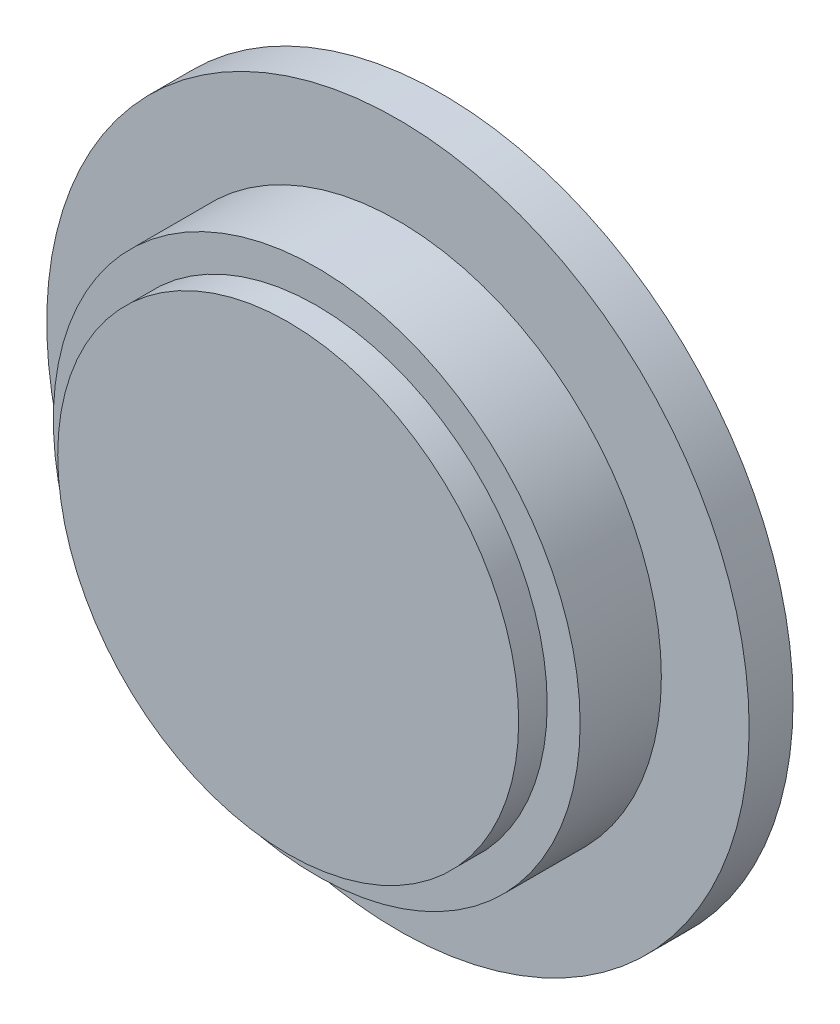
ISO-10303-21;
HEADER;
FILE_DESCRIPTION(('STEP AP214'),'2;1');
FILE_NAME('part.step','',(''),(''),'','','');
FILE_SCHEMA(('AUTOMOTIVE_DESIGN { 1 0 10303 214 1 1 1 1 }'));
ENDSEC;
DATA;
#1=APPLICATION_CONTEXT('core data for automotive mechanical design processes');
#2=APPLICATION_PROTOCOL_DEFINITION('international standard','automotive_design',2000,#1);
#3=PRODUCT_CONTEXT('',#1,'mechanical');
#4=PRODUCT('Part','Part','',(#3));
#5=PRODUCT_RELATED_PRODUCT_CATEGORY('part','',(#4));
#6=PRODUCT_DEFINITION_FORMATION('','',#4);
#7=PRODUCT_DEFINITION_CONTEXT('part definition',#1,'design');
#8=PRODUCT_DEFINITION('design','',#6,#7);
#9=PRODUCT_DEFINITION_SHAPE('','',#8);
#10=(LENGTH_UNIT() NAMED_UNIT(*) SI_UNIT(.MILLI.,.METRE.));
#11=(NAMED_UNIT(*) PLANE_ANGLE_UNIT() SI_UNIT($,.RADIAN.));
#12=(NAMED_UNIT(*) SI_UNIT($,.STERADIAN.) SOLID_ANGLE_UNIT());
#13=UNCERTAINTY_MEASURE_WITH_UNIT(LENGTH_MEASURE(1.E-05),#10,'distance_accuracy_value','');
#14=(GEOMETRIC_REPRESENTATION_CONTEXT(3) GLOBAL_UNCERTAINTY_ASSIGNED_CONTEXT((#13)) GLOBAL_UNIT_ASSIGNED_CONTEXT((#10,
#11,#12)) REPRESENTATION_CONTEXT('',''));
#15=CARTESIAN_POINT('',(0.,0.,0.));
#16=DIRECTION('',(0.,0.,1.));
#17=DIRECTION('',(1.,0.,0.));
#18=AXIS2_PLACEMENT_3D('',#15,#16,#17);
#19=CARTESIAN_POINT('',(0.,0.,20.));
#20=DIRECTION('',(0.,0.,-1.));
#21=DIRECTION('',(-1.,0.,0.));
#22=AXIS2_PLACEMENT_3D('',#19,#20,#21);
#23=CYLINDRICAL_SURFACE('',#22,160.);
#24=CARTESIAN_POINT('',(0.,0.,20.));
#25=DIRECTION('',(0.,0.,1.));
#26=DIRECTION('',(1.,0.,0.));
#27=AXIS2_PLACEMENT_3D('',#24,#25,#26);
#28=CIRCLE('',#27,160.);
#29=CARTESIAN_POINT('',(160.,0.,20.));
#30=VERTEX_POINT('',#29);
#31=EDGE_CURVE('E67',#30,#30,#28,.T.);
#32=ORIENTED_EDGE('',*,*,#31,.F.);
#33=EDGE_LOOP('',(#32));
#34=FACE_BOUND('',#33,.T.);
#35=CARTESIAN_POINT('',(0.,0.,0.));
#36=DIRECTION('',(0.,0.,1.));
#37=DIRECTION('',(1.,0.,0.));
#38=AXIS2_PLACEMENT_3D('',#35,#36,#37);
#39=CIRCLE('',#38,160.);
#40=CARTESIAN_POINT('',(160.,0.,0.));
#41=VERTEX_POINT('',#40);
#42=EDGE_CURVE('E46',#41,#41,#39,.T.);
#43=ORIENTED_EDGE('',*,*,#42,.T.);
#44=EDGE_LOOP('',(#43));
#45=FACE_BOUND('',#44,.T.);
#46=ADVANCED_FACE('F43',(#34,#45),#23,.T.);
#47=CARTESIAN_POINT('',(0.,0.,20.));
#48=DIRECTION('',(0.,0.,1.));
#49=DIRECTION('',(1.,0.,0.));
#50=AXIS2_PLACEMENT_3D('',#47,#48,#49);
#51=PLANE('',#50);
#52=CARTESIAN_POINT('',(0.,0.,20.));
#53=DIRECTION('',(0.,0.,1.));
#54=DIRECTION('',(1.,0.,0.));
#55=AXIS2_PLACEMENT_3D('',#52,#53,#54);
#56=CIRCLE('',#55,120.);
#57=CARTESIAN_POINT('',(120.,0.,20.));
#58=VERTEX_POINT('',#57);
#59=EDGE_CURVE('E55',#58,#58,#56,.T.);
#60=ORIENTED_EDGE('',*,*,#59,.F.);
#61=EDGE_LOOP('',(#60));
#62=FACE_BOUND('',#61,.T.);
#63=ORIENTED_EDGE('',*,*,#31,.T.);
#64=EDGE_LOOP('',(#63));
#65=FACE_BOUND('',#64,.T.);
#66=ADVANCED_FACE('F78',(#62,#65),#51,.T.);
#67=CARTESIAN_POINT('',(0.,0.,0.));
#68=DIRECTION('',(0.,0.,1.));
#69=DIRECTION('',(1.,0.,0.));
#70=AXIS2_PLACEMENT_3D('',#67,#68,#69);
#71=PLANE('',#70);
#72=CARTESIAN_POINT('',(0.,0.,0.));
#73=DIRECTION('',(0.,0.,-1.));
#74=DIRECTION('',(-1.,0.,0.));
#75=AXIS2_PLACEMENT_3D('',#72,#73,#74);
#76=CIRCLE('',#75,88.);
#77=CARTESIAN_POINT('',(-88.,0.,0.));
#78=VERTEX_POINT('',#77);
#79=EDGE_CURVE('E50',#78,#78,#76,.T.);
#80=ORIENTED_EDGE('',*,*,#79,.F.);
#81=EDGE_LOOP('',(#80));
#82=FACE_BOUND('',#81,.T.);
#83=ORIENTED_EDGE('',*,*,#42,.F.);
#84=EDGE_LOOP('',(#83));
#85=FACE_BOUND('',#84,.T.);
#86=ADVANCED_FACE('F75',(#82,#85),#71,.F.);
#87=CARTESIAN_POINT('',(0.,0.,57.));
#88=DIRECTION('',(0.,0.,-1.));
#89=DIRECTION('',(-1.,0.,0.));
#90=AXIS2_PLACEMENT_3D('',#87,#88,#89);
#91=CYLINDRICAL_SURFACE('',#90,120.);
#92=CARTESIAN_POINT('',(0.,0.,57.));
#93=DIRECTION('',(0.,0.,1.));
#94=DIRECTION('',(1.,0.,0.));
#95=AXIS2_PLACEMENT_3D('',#92,#93,#94);
#96=CIRCLE('',#95,120.);
#97=CARTESIAN_POINT('',(120.,0.,57.));
#98=VERTEX_POINT('',#97);
#99=EDGE_CURVE('E62',#98,#98,#96,.T.);
#100=ORIENTED_EDGE('',*,*,#99,.F.);
#101=EDGE_LOOP('',(#100));
#102=FACE_BOUND('',#101,.T.);
#103=ORIENTED_EDGE('',*,*,#59,.T.);
#104=EDGE_LOOP('',(#103));
#105=FACE_BOUND('',#104,.T.);
#106=ADVANCED_FACE('F77',(#102,#105),#91,.T.);
#107=CARTESIAN_POINT('',(0.,0.,57.));
#108=DIRECTION('',(0.,0.,1.));
#109=DIRECTION('',(1.,0.,0.));
#110=AXIS2_PLACEMENT_3D('',#107,#108,#109);
#111=PLANE('',#110);
#112=CARTESIAN_POINT('',(0.,0.,57.));
#113=DIRECTION('',(0.,0.,1.));
#114=DIRECTION('',(1.,0.,0.));
#115=AXIS2_PLACEMENT_3D('',#112,#113,#114);
#116=CIRCLE('',#115,105.);
#117=CARTESIAN_POINT('',(-105.,0.,57.));
#118=VERTEX_POINT('',#117);
#119=EDGE_CURVE('E12',#118,#118,#116,.T.);
#120=ORIENTED_EDGE('',*,*,#119,.F.);
#121=EDGE_LOOP('',(#120));
#122=FACE_BOUND('',#121,.T.);
#123=ORIENTED_EDGE('',*,*,#99,.T.);
#124=EDGE_LOOP('',(#123));
#125=FACE_BOUND('',#124,.T.);
#126=ADVANCED_FACE('F84',(#122,#125),#111,.T.);
#127=CARTESIAN_POINT('',(0.,0.,-10.));
#128=DIRECTION('',(0.,0.,1.));
#129=DIRECTION('',(1.,0.,0.));
#130=AXIS2_PLACEMENT_3D('',#127,#128,#129);
#131=CYLINDRICAL_SURFACE('',#130,88.);
#132=CARTESIAN_POINT('',(0.,0.,-10.));
#133=DIRECTION('',(0.,0.,-1.));
#134=DIRECTION('',(-1.,0.,0.));
#135=AXIS2_PLACEMENT_3D('',#132,#133,#134);
#136=CIRCLE('',#135,88.);
#137=CARTESIAN_POINT('',(-88.,0.,-10.));
#138=VERTEX_POINT('',#137);
#139=EDGE_CURVE('E60',#138,#138,#136,.T.);
#140=ORIENTED_EDGE('',*,*,#139,.F.);
#141=EDGE_LOOP('',(#140));
#142=FACE_BOUND('',#141,.T.);
#143=ORIENTED_EDGE('',*,*,#79,.T.);
#144=EDGE_LOOP('',(#143));
#145=FACE_BOUND('',#144,.T.);
#146=ADVANCED_FACE('F115',(#142,#145),#131,.T.);
#147=CARTESIAN_POINT('',(0.,0.,-10.));
#148=DIRECTION('',(0.,0.,-1.));
#149=DIRECTION('',(-1.,0.,0.));
#150=AXIS2_PLACEMENT_3D('',#147,#148,#149);
#151=PLANE('',#150);
#152=ORIENTED_EDGE('',*,*,#139,.T.);
#153=EDGE_LOOP('',(#152));
#154=FACE_BOUND('',#153,.T.);
#155=ADVANCED_FACE('F120',(#154),#151,.T.);
#156=CARTESIAN_POINT('',(0.,0.,70.));
#157=DIRECTION('',(0.,0.,-1.));
#158=DIRECTION('',(-1.,0.,0.));
#159=AXIS2_PLACEMENT_3D('',#156,#157,#158);
#160=CYLINDRICAL_SURFACE('',#159,105.);
#161=CARTESIAN_POINT('',(0.,0.,70.));
#162=DIRECTION('',(0.,0.,1.));
#163=DIRECTION('',(1.,0.,0.));
#164=AXIS2_PLACEMENT_3D('',#161,#162,#163);
#165=CIRCLE('',#164,105.);
#166=CARTESIAN_POINT('',(-105.,0.,70.));
#167=VERTEX_POINT('',#166);
#168=EDGE_CURVE('E59',#167,#167,#165,.T.);
#169=CARTESIAN_POINT('',(-105.,0.,70.));
#170=CARTESIAN_POINT('',(-105.,0.,69.8645833333333));
#171=CARTESIAN_POINT('',(-105.,0.,69.7291666666666));
#172=CARTESIAN_POINT('',(-105.,0.,69.4583333333333));
#173=CARTESIAN_POINT('',(-105.,0.,69.3229166666667));
#174=CARTESIAN_POINT('',(-105.,0.,69.0520833333333));
#175=CARTESIAN_POINT('',(-105.,0.,68.9166666666667));
#176=CARTESIAN_POINT('',(-105.,0.,68.6458333333333));
#177=CARTESIAN_POINT('',(-105.,0.,68.5104166666667));
#178=CARTESIAN_POINT('',(-105.,0.,68.2395833333333));
#179=CARTESIAN_POINT('',(-105.,0.,68.1041666666666));
#180=CARTESIAN_POINT('',(-105.,0.,67.8333333333333));
#181=CARTESIAN_POINT('',(-105.,0.,67.6979166666666));
#182=CARTESIAN_POINT('',(-105.,0.,67.4270833333333));
#183=CARTESIAN_POINT('',(-105.,0.,67.2916666666667));
#184=CARTESIAN_POINT('',(-105.,0.,67.0208333333333));
#185=CARTESIAN_POINT('',(-105.,0.,66.8854166666667));
#186=CARTESIAN_POINT('',(-105.,0.,66.6145833333333));
#187=CARTESIAN_POINT('',(-105.,0.,66.4791666666667));
#188=CARTESIAN_POINT('',(-105.,0.,66.2083333333333));
#189=CARTESIAN_POINT('',(-105.,0.,66.0729166666666));
#190=CARTESIAN_POINT('',(-105.,0.,65.8020833333333));
#191=CARTESIAN_POINT('',(-105.,0.,65.6666666666667));
#192=CARTESIAN_POINT('',(-105.,0.,65.3958333333333));
#193=CARTESIAN_POINT('',(-105.,0.,65.2604166666667));
#194=CARTESIAN_POINT('',(-105.,0.,64.9895833333333));
#195=CARTESIAN_POINT('',(-105.,0.,64.8541666666667));
#196=CARTESIAN_POINT('',(-105.,0.,64.5833333333333));
#197=CARTESIAN_POINT('',(-105.,0.,64.4479166666667));
#198=CARTESIAN_POINT('',(-105.,0.,64.1770833333333));
#199=CARTESIAN_POINT('',(-105.,0.,64.0416666666666));
#200=CARTESIAN_POINT('',(-105.,0.,63.7708333333333));
#201=CARTESIAN_POINT('',(-105.,0.,63.6354166666667));
#202=CARTESIAN_POINT('',(-105.,0.,63.3645833333333));
#203=CARTESIAN_POINT('',(-105.,0.,63.2291666666667));
#204=CARTESIAN_POINT('',(-105.,0.,62.9583333333333));
#205=CARTESIAN_POINT('',(-105.,0.,62.8229166666667));
#206=CARTESIAN_POINT('',(-105.,0.,62.5520833333333));
#207=CARTESIAN_POINT('',(-105.,0.,62.4166666666667));
#208=CARTESIAN_POINT('',(-105.,0.,62.1458333333333));
#209=CARTESIAN_POINT('',(-105.,0.,62.0104166666667));
#210=CARTESIAN_POINT('',(-105.,0.,61.7395833333333));
#211=CARTESIAN_POINT('',(-105.,0.,61.6041666666667));
#212=CARTESIAN_POINT('',(-105.,0.,61.3333333333333));
#213=CARTESIAN_POINT('',(-105.,0.,61.1979166666667));
#214=CARTESIAN_POINT('',(-105.,0.,60.9270833333333));
#215=CARTESIAN_POINT('',(-105.,0.,60.7916666666667));
#216=CARTESIAN_POINT('',(-105.,0.,60.5208333333333));
#217=CARTESIAN_POINT('',(-105.,0.,60.3854166666667));
#218=CARTESIAN_POINT('',(-105.,0.,60.1145833333333));
#219=CARTESIAN_POINT('',(-105.,0.,59.9791666666667));
#220=CARTESIAN_POINT('',(-105.,0.,59.7083333333333));
#221=CARTESIAN_POINT('',(-105.,0.,59.5729166666667));
#222=CARTESIAN_POINT('',(-105.,0.,59.3020833333333));
#223=CARTESIAN_POINT('',(-105.,0.,59.1666666666667));
#224=CARTESIAN_POINT('',(-105.,0.,58.8958333333333));
#225=CARTESIAN_POINT('',(-105.,0.,58.7604166666667));
#226=CARTESIAN_POINT('',(-105.,0.,58.4895833333333));
#227=CARTESIAN_POINT('',(-105.,0.,58.3541666666667));
#228=CARTESIAN_POINT('',(-105.,0.,58.0833333333333));
#229=CARTESIAN_POINT('',(-105.,0.,57.9479166666667));
#230=CARTESIAN_POINT('',(-105.,0.,57.6770833333333));
#231=CARTESIAN_POINT('',(-105.,0.,57.5416666666667));
#232=CARTESIAN_POINT('',(-105.,0.,57.2708333333333));
#233=CARTESIAN_POINT('',(-105.,0.,57.1354166666667));
#234=CARTESIAN_POINT('',(-105.,0.,57.));
#235=B_SPLINE_CURVE_WITH_KNOTS('',3,(#169,#170,#171,#172,#173,#174,#175,#176,#177,#178,#179,
#180,#181,#182,#183,#184,#185,#186,#187,#188,#189,#190,#191,#192,#193,#194,#195,#196,#197,#198,
#199,#200,#201,#202,#203,#204,#205,#206,#207,#208,#209,#210,#211,#212,#213,#214,#215,#216,#217,
#218,#219,#220,#221,#222,#223,#224,#225,#226,#227,#228,#229,#230,#231,#232,#233,#234),
.UNSPECIFIED.,.F.,.F.,(4,2,2,2,2,2,2,2,2,2,2,2,2,2,2,2,2,2,2,2,2,2,2,2,2,2,2,2,2,2,2,2,4),(0.,
0.406250000000011,0.812500000000008,1.21875,1.625,2.03125000000001,2.43750000000001,
2.84375000000001,3.25,3.65625,4.06250000000001,4.46875000000001,4.875,5.28125,5.6875,
6.09375000000001,6.50000000000001,6.90625,7.3125,7.71875,8.12500000000001,8.53125,8.9375,
9.34375000000001,9.75,10.15625,10.5625,10.96875,11.375,11.78125,12.1875,12.59375,13.),.UNSPECIFIED.);
#236=EDGE_CURVE('BSEAM130',#167,#118,#235,.T.);
#237=ORIENTED_EDGE('',*,*,#168,.F.);
#238=ORIENTED_EDGE('',*,*,#119,.T.);
#239=ORIENTED_EDGE('',*,*,#236,.T.);
#240=ORIENTED_EDGE('',*,*,#236,.F.);
#241=EDGE_LOOP('',(#237,#239,#238,#240));
#242=FACE_BOUND('',#241,.T.);
#243=ADVANCED_FACE('F130',(#242),#160,.T.);
#244=CARTESIAN_POINT('',(0.,0.,70.));
#245=DIRECTION('',(0.,0.,1.));
#246=DIRECTION('',(1.,0.,0.));
#247=AXIS2_PLACEMENT_3D('',#244,#245,#246);
#248=PLANE('',#247);
#249=ORIENTED_EDGE('',*,*,#168,.T.);
#250=EDGE_LOOP('',(#249));
#251=FACE_BOUND('',#250,.T.);
#252=ADVANCED_FACE('F147',(#251),#248,.T.);
#253=CLOSED_SHELL('',(#46,#66,#86,#106,#126,#146,#155,#243,#252));
#254=MANIFOLD_SOLID_BREP('B2',#253);
#255=ADVANCED_BREP_SHAPE_REPRESENTATION('',(#18,#254),#14);
#256=SHAPE_DEFINITION_REPRESENTATION(#9,#255);
ENDSEC;
END-ISO-10303-21;
